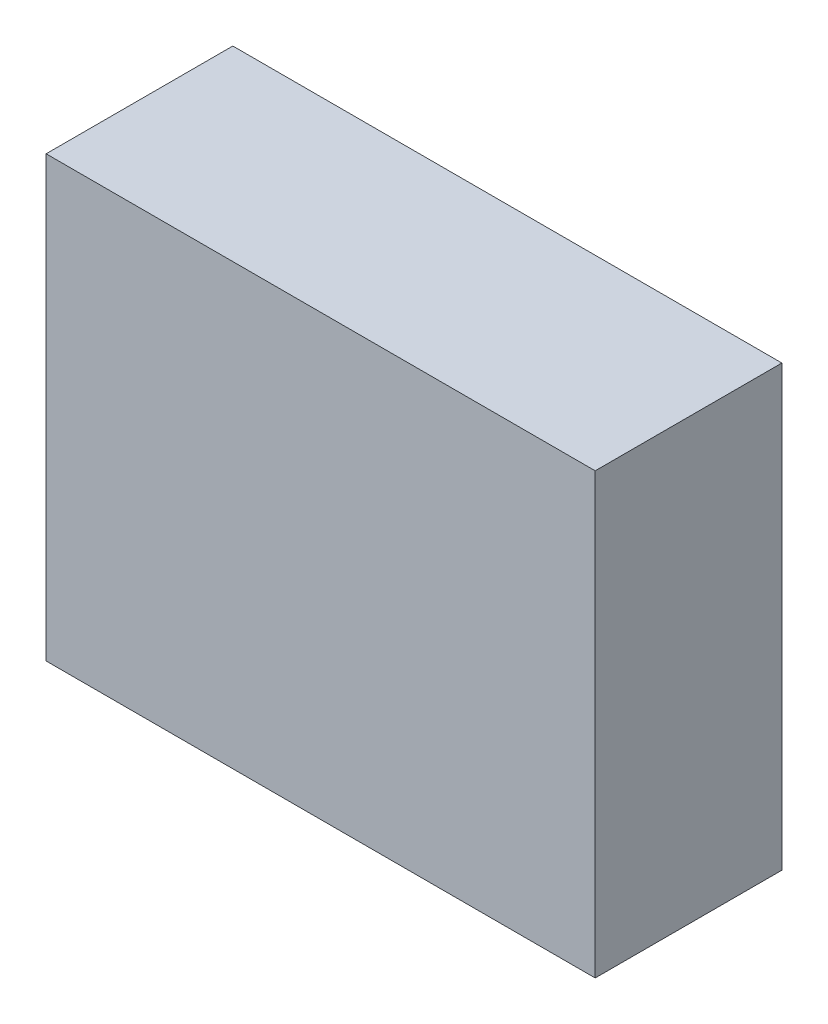
ISO-10303-21;
HEADER;
FILE_DESCRIPTION(('STEP AP214'),'2;1');
FILE_NAME('part.step','',(''),(''),'','','');
FILE_SCHEMA(('AUTOMOTIVE_DESIGN { 1 0 10303 214 1 1 1 1 }'));
ENDSEC;
DATA;
#1=APPLICATION_CONTEXT('core data for automotive mechanical design processes');
#2=APPLICATION_PROTOCOL_DEFINITION('international standard','automotive_design',2000,#1);
#3=PRODUCT_CONTEXT('',#1,'mechanical');
#4=PRODUCT('Part','Part','',(#3));
#5=PRODUCT_RELATED_PRODUCT_CATEGORY('part','',(#4));
#6=PRODUCT_DEFINITION_FORMATION('','',#4);
#7=PRODUCT_DEFINITION_CONTEXT('part definition',#1,'design');
#8=PRODUCT_DEFINITION('design','',#6,#7);
#9=PRODUCT_DEFINITION_SHAPE('','',#8);
#10=(LENGTH_UNIT() NAMED_UNIT(*) SI_UNIT(.MILLI.,.METRE.));
#11=(NAMED_UNIT(*) PLANE_ANGLE_UNIT() SI_UNIT($,.RADIAN.));
#12=(NAMED_UNIT(*) SI_UNIT($,.STERADIAN.) SOLID_ANGLE_UNIT());
#13=UNCERTAINTY_MEASURE_WITH_UNIT(LENGTH_MEASURE(1.E-05),#10,'distance_accuracy_value','');
#14=(GEOMETRIC_REPRESENTATION_CONTEXT(3) GLOBAL_UNCERTAINTY_ASSIGNED_CONTEXT((#13)) GLOBAL_UNIT_ASSIGNED_CONTEXT((#10,
#11,#12)) REPRESENTATION_CONTEXT('',''));
#15=CARTESIAN_POINT('',(0.,0.,0.));
#16=DIRECTION('',(0.,0.,1.));
#17=DIRECTION('',(1.,0.,0.));
#18=AXIS2_PLACEMENT_3D('',#15,#16,#17);
#19=CARTESIAN_POINT('',(-1.25000004,-1.00000054,0.85000084));
#20=DIRECTION('',(0.,0.,-1.));
#21=DIRECTION('',(-1.,0.,0.));
#22=AXIS2_PLACEMENT_3D('',#19,#20,#21);
#23=PLANE('',#22);
#24=DIRECTION('',(0.,1.,0.));
#25=VECTOR('',#24,1.);
#26=CARTESIAN_POINT('',(1.25000004,-1.00000054,0.85000084));
#27=LINE('',#26,#25);
#28=CARTESIAN_POINT('',(1.25000004,-1.00000054,0.85000084));
#29=VERTEX_POINT('',#28);
#30=CARTESIAN_POINT('',(1.25000004,1.00000054,0.85000084));
#31=VERTEX_POINT('',#30);
#32=EDGE_CURVE('E55',#29,#31,#27,.T.);
#33=ORIENTED_EDGE('',*,*,#32,.T.);
#34=DIRECTION('',(1.,0.,0.));
#35=VECTOR('',#34,1.);
#36=CARTESIAN_POINT('',(1.25000004,1.00000054,0.85000084));
#37=LINE('',#36,#35);
#38=CARTESIAN_POINT('',(-1.25000004,1.00000054,0.85000084));
#39=VERTEX_POINT('',#38);
#40=EDGE_CURVE('E57',#31,#39,#37,.F.);
#41=ORIENTED_EDGE('',*,*,#40,.T.);
#42=DIRECTION('',(0.,1.,0.));
#43=VECTOR('',#42,1.);
#44=CARTESIAN_POINT('',(-1.25000004,1.00000054,0.85000084));
#45=LINE('',#44,#43);
#46=CARTESIAN_POINT('',(-1.25000004,-1.00000054,0.85000084));
#47=VERTEX_POINT('',#46);
#48=EDGE_CURVE('E20',#39,#47,#45,.F.);
#49=ORIENTED_EDGE('',*,*,#48,.T.);
#50=DIRECTION('',(1.,0.,0.));
#51=VECTOR('',#50,1.);
#52=CARTESIAN_POINT('',(-1.25000004,-1.00000054,0.85000084));
#53=LINE('',#52,#51);
#54=EDGE_CURVE('E80',#47,#29,#53,.T.);
#55=ORIENTED_EDGE('',*,*,#54,.T.);
#56=EDGE_LOOP('',(#33,#41,#49,#55));
#57=FACE_BOUND('',#56,.T.);
#58=ADVANCED_FACE('F17',(#57),#23,.F.);
#59=CARTESIAN_POINT('',(-1.25000004,1.00000054,0.));
#60=DIRECTION('',(1.,0.,0.));
#61=DIRECTION('',(0.,0.,-1.));
#62=AXIS2_PLACEMENT_3D('',#59,#60,#61);
#63=PLANE('',#62);
#64=DIRECTION('',(0.,0.,1.));
#65=VECTOR('',#64,1.);
#66=CARTESIAN_POINT('',(-1.25000004,-1.00000054,0.));
#67=LINE('',#66,#65);
#68=CARTESIAN_POINT('',(-1.25000004,-1.00000054,0.));
#69=VERTEX_POINT('',#68);
#70=EDGE_CURVE('E68',#69,#47,#67,.T.);
#71=ORIENTED_EDGE('',*,*,#70,.T.);
#72=ORIENTED_EDGE('',*,*,#48,.F.);
#73=DIRECTION('',(0.,0.,-1.));
#74=VECTOR('',#73,1.);
#75=CARTESIAN_POINT('',(-1.25000004,1.00000054,0.));
#76=LINE('',#75,#74);
#77=CARTESIAN_POINT('',(-1.25000004,1.00000054,0.));
#78=VERTEX_POINT('',#77);
#79=EDGE_CURVE('E63',#39,#78,#76,.T.);
#80=ORIENTED_EDGE('',*,*,#79,.T.);
#81=DIRECTION('',(0.,1.,0.));
#82=VECTOR('',#81,1.);
#83=CARTESIAN_POINT('',(-1.25000004,-1.00000054,0.));
#84=LINE('',#83,#82);
#85=EDGE_CURVE('E83',#69,#78,#84,.T.);
#86=ORIENTED_EDGE('',*,*,#85,.F.);
#87=EDGE_LOOP('',(#71,#72,#80,#86));
#88=FACE_BOUND('',#87,.T.);
#89=ADVANCED_FACE('F65',(#88),#63,.F.);
#90=CARTESIAN_POINT('',(1.25000004,1.00000054,0.));
#91=DIRECTION('',(0.,-1.,0.));
#92=DIRECTION('',(0.,0.,-1.));
#93=AXIS2_PLACEMENT_3D('',#90,#91,#92);
#94=PLANE('',#93);
#95=ORIENTED_EDGE('',*,*,#79,.F.);
#96=ORIENTED_EDGE('',*,*,#40,.F.);
#97=DIRECTION('',(0.,0.,1.));
#98=VECTOR('',#97,1.);
#99=CARTESIAN_POINT('',(1.25000004,1.00000054,0.));
#100=LINE('',#99,#98);
#101=CARTESIAN_POINT('',(1.25000004,1.00000054,0.));
#102=VERTEX_POINT('',#101);
#103=EDGE_CURVE('E75',#31,#102,#100,.F.);
#104=ORIENTED_EDGE('',*,*,#103,.T.);
#105=DIRECTION('',(-1.,0.,0.));
#106=VECTOR('',#105,1.);
#107=CARTESIAN_POINT('',(-1.25000004,1.00000054,0.));
#108=LINE('',#107,#106);
#109=EDGE_CURVE('E72',#78,#102,#108,.F.);
#110=ORIENTED_EDGE('',*,*,#109,.F.);
#111=EDGE_LOOP('',(#95,#96,#104,#110));
#112=FACE_BOUND('',#111,.T.);
#113=ADVANCED_FACE('F70',(#112),#94,.F.);
#114=CARTESIAN_POINT('',(1.25000004,-1.00000054,0.));
#115=DIRECTION('',(-1.,0.,0.));
#116=DIRECTION('',(0.,0.,1.));
#117=AXIS2_PLACEMENT_3D('',#114,#115,#116);
#118=PLANE('',#117);
#119=ORIENTED_EDGE('',*,*,#103,.F.);
#120=ORIENTED_EDGE('',*,*,#32,.F.);
#121=DIRECTION('',(0.,0.,1.));
#122=VECTOR('',#121,1.);
#123=CARTESIAN_POINT('',(1.25000004,-1.00000054,0.));
#124=LINE('',#123,#122);
#125=CARTESIAN_POINT('',(1.25000004,-1.00000054,0.));
#126=VERTEX_POINT('',#125);
#127=EDGE_CURVE('E35',#29,#126,#124,.F.);
#128=ORIENTED_EDGE('',*,*,#127,.T.);
#129=DIRECTION('',(0.,1.,0.));
#130=VECTOR('',#129,1.);
#131=CARTESIAN_POINT('',(1.25000004,-1.00000054,0.));
#132=LINE('',#131,#130);
#133=EDGE_CURVE('E26',#102,#126,#132,.F.);
#134=ORIENTED_EDGE('',*,*,#133,.F.);
#135=EDGE_LOOP('',(#119,#120,#128,#134));
#136=FACE_BOUND('',#135,.T.);
#137=ADVANCED_FACE('F89',(#136),#118,.F.);
#138=CARTESIAN_POINT('',(-1.25000004,-1.00000054,0.));
#139=DIRECTION('',(0.,1.,0.));
#140=DIRECTION('',(0.,0.,1.));
#141=AXIS2_PLACEMENT_3D('',#138,#139,#140);
#142=PLANE('',#141);
#143=ORIENTED_EDGE('',*,*,#127,.F.);
#144=ORIENTED_EDGE('',*,*,#54,.F.);
#145=ORIENTED_EDGE('',*,*,#70,.F.);
#146=DIRECTION('',(-1.,0.,0.));
#147=VECTOR('',#146,1.);
#148=CARTESIAN_POINT('',(-1.25000004,-1.00000054,0.));
#149=LINE('',#148,#147);
#150=EDGE_CURVE('E11',#126,#69,#149,.T.);
#151=ORIENTED_EDGE('',*,*,#150,.F.);
#152=EDGE_LOOP('',(#143,#144,#145,#151));
#153=FACE_BOUND('',#152,.T.);
#154=ADVANCED_FACE('F91',(#153),#142,.F.);
#155=CARTESIAN_POINT('',(-1.25000004,-1.00000054,0.));
#156=DIRECTION('',(0.,0.,-1.));
#157=DIRECTION('',(-1.,0.,0.));
#158=AXIS2_PLACEMENT_3D('',#155,#156,#157);
#159=PLANE('',#158);
#160=ORIENTED_EDGE('',*,*,#133,.T.);
#161=ORIENTED_EDGE('',*,*,#150,.T.);
#162=ORIENTED_EDGE('',*,*,#85,.T.);
#163=ORIENTED_EDGE('',*,*,#109,.T.);
#164=EDGE_LOOP('',(#160,#161,#162,#163));
#165=FACE_BOUND('',#164,.T.);
#166=ADVANCED_FACE('F88',(#165),#159,.T.);
#167=CLOSED_SHELL('',(#58,#89,#113,#137,#154,#166));
#168=MANIFOLD_SOLID_BREP('B1',#167);
#169=ADVANCED_BREP_SHAPE_REPRESENTATION('',(#18,#168),#14);
#170=SHAPE_DEFINITION_REPRESENTATION(#9,#169);
ENDSEC;
END-ISO-10303-21;
